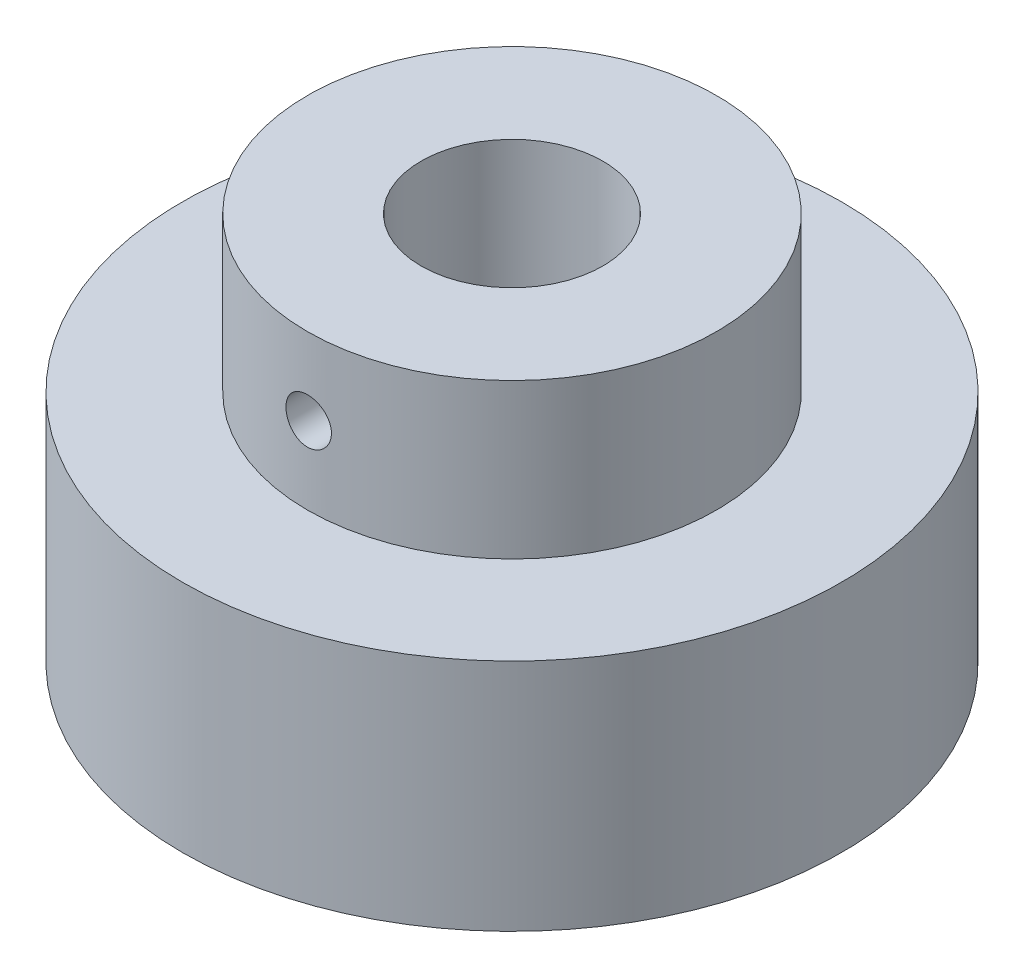
ISO-10303-21;
HEADER;
FILE_DESCRIPTION(('STEP AP214'),'2;1');
FILE_NAME('part.step','',(''),(''),'','','');
FILE_SCHEMA(('AUTOMOTIVE_DESIGN { 1 0 10303 214 1 1 1 1 }'));
ENDSEC;
DATA;
#1=APPLICATION_CONTEXT('core data for automotive mechanical design processes');
#2=APPLICATION_PROTOCOL_DEFINITION('international standard','automotive_design',2000,#1);
#3=PRODUCT_CONTEXT('',#1,'mechanical');
#4=PRODUCT('Part','Part','',(#3));
#5=PRODUCT_RELATED_PRODUCT_CATEGORY('part','',(#4));
#6=PRODUCT_DEFINITION_FORMATION('','',#4);
#7=PRODUCT_DEFINITION_CONTEXT('part definition',#1,'design');
#8=PRODUCT_DEFINITION('design','',#6,#7);
#9=PRODUCT_DEFINITION_SHAPE('','',#8);
#10=(LENGTH_UNIT() NAMED_UNIT(*) SI_UNIT(.MILLI.,.METRE.));
#11=(NAMED_UNIT(*) PLANE_ANGLE_UNIT() SI_UNIT($,.RADIAN.));
#12=(NAMED_UNIT(*) SI_UNIT($,.STERADIAN.) SOLID_ANGLE_UNIT());
#13=UNCERTAINTY_MEASURE_WITH_UNIT(LENGTH_MEASURE(1.E-05),#10,'distance_accuracy_value','');
#14=(GEOMETRIC_REPRESENTATION_CONTEXT(3) GLOBAL_UNCERTAINTY_ASSIGNED_CONTEXT((#13)) GLOBAL_UNIT_ASSIGNED_CONTEXT((#10,
#11,#12)) REPRESENTATION_CONTEXT('',''));
#15=CARTESIAN_POINT('',(0.,0.,0.));
#16=DIRECTION('',(0.,0.,1.));
#17=DIRECTION('',(1.,0.,0.));
#18=AXIS2_PLACEMENT_3D('',#15,#16,#17);
#19=CARTESIAN_POINT('',(0.,10.3,0.));
#20=DIRECTION('',(0.,-1.,0.));
#21=DIRECTION('',(0.,0.,-1.));
#22=AXIS2_PLACEMENT_3D('',#19,#20,#21);
#23=CYLINDRICAL_SURFACE('',#22,4.);
#24=CARTESIAN_POINT('',(0.,17.1,0.));
#25=DIRECTION('',(0.,1.,0.));
#26=DIRECTION('',(0.,0.,1.));
#27=AXIS2_PLACEMENT_3D('',#24,#25,#26);
#28=CIRCLE('',#27,4.);
#29=CARTESIAN_POINT('',(0.,17.1,4.));
#30=VERTEX_POINT('',#29);
#31=EDGE_CURVE('E51',#30,#30,#28,.T.);
#32=ORIENTED_EDGE('',*,*,#31,.T.);
#33=EDGE_LOOP('',(#32));
#34=FACE_BOUND('',#33,.T.);
#35=CARTESIAN_POINT('',(0.,0.,0.));
#36=DIRECTION('',(0.,1.,0.));
#37=DIRECTION('',(0.,0.,1.));
#38=AXIS2_PLACEMENT_3D('',#35,#36,#37);
#39=CIRCLE('',#38,4.);
#40=CARTESIAN_POINT('',(0.,0.,4.));
#41=VERTEX_POINT('',#40);
#42=EDGE_CURVE('E43',#41,#41,#39,.T.);
#43=ORIENTED_EDGE('',*,*,#42,.F.);
#44=EDGE_LOOP('',(#43));
#45=FACE_BOUND('',#44,.T.);
#46=CARTESIAN_POINT('',(-1.,13.7,3.87298334620741));
#47=CARTESIAN_POINT('',(-0.999998431438699,13.7552203003568,3.87298440057185));
#48=CARTESIAN_POINT('',(-0.995410498208069,13.8104579594314,3.87417722499278));
#49=CARTESIAN_POINT('',(-0.977209250194446,13.9193470312326,3.87880744892249));
#50=CARTESIAN_POINT('',(-0.963590682698077,13.97299750178,3.8822461547418));
#51=CARTESIAN_POINT('',(-0.927796479849634,14.0771214152878,3.89095489813012));
#52=CARTESIAN_POINT('',(-0.905631891140943,14.1275988621578,3.8962225706936));
#53=CARTESIAN_POINT('',(-0.853408456505407,14.2241243410125,3.90799276818327));
#54=CARTESIAN_POINT('',(-0.823349275424505,14.2701721848311,3.91449534553241));
#55=CARTESIAN_POINT('',(-0.755483370924517,14.3575446581058,3.92816286540368));
#56=CARTESIAN_POINT('',(-0.717534755081556,14.3987574401403,3.93533839048709));
#57=CARTESIAN_POINT('',(-0.635272825640327,14.4743045577439,3.94945150206622));
#58=CARTESIAN_POINT('',(-0.590958917672138,14.5086382502486,3.95638906626691));
#59=CARTESIAN_POINT('',(-0.496458080431563,14.5699101870526,3.96936166208095));
#60=CARTESIAN_POINT('',(-0.446197830478042,14.5967385552646,3.975382749602));
#61=CARTESIAN_POINT('',(-0.341705273717108,14.6415238576612,3.9857232477043));
#62=CARTESIAN_POINT('',(-0.287473554316776,14.6594821007662,3.99004290933747));
#63=CARTESIAN_POINT('',(-0.177743503501662,14.6856591338314,3.99641903539262));
#64=CARTESIAN_POINT('',(-0.122293087819588,14.6940678577306,3.99851957537723));
#65=CARTESIAN_POINT('',(-0.0107315277051064,14.7015033517102,4.00037437642922));
#66=CARTESIAN_POINT('',(0.0453795178152289,14.7005315088838,4.00012898438682));
#67=CARTESIAN_POINT('',(0.155352247172389,14.6893700598999,3.99735237981413));
#68=CARTESIAN_POINT('',(0.209236215601069,14.6793854699785,3.99487200936349));
#69=CARTESIAN_POINT('',(0.314538247413688,14.6508114919806,3.98796334609942));
#70=CARTESIAN_POINT('',(0.365956179370439,14.632221645849,3.98353494959376));
#71=CARTESIAN_POINT('',(0.465406703501808,14.5867989717252,3.97315003880358));
#72=CARTESIAN_POINT('',(0.513404509766506,14.5598931821353,3.96718007878021));
#73=CARTESIAN_POINT('',(0.60427562234049,14.4986577283535,3.9543596152386));
#74=CARTESIAN_POINT('',(0.647148035085507,14.4643267725758,3.94750895860996));
#75=CARTESIAN_POINT('',(0.727774035084958,14.388116503207,3.93345485507808));
#76=CARTESIAN_POINT('',(0.765357679075201,14.3460580430609,3.92624687810367));
#77=CARTESIAN_POINT('',(0.83297637596302,14.2561600105839,3.91246017406682));
#78=CARTESIAN_POINT('',(0.863011076046017,14.2083201682036,3.90588147642388));
#79=CARTESIAN_POINT('',(0.914788129022599,14.1078839863404,3.89408198732659));
#80=CARTESIAN_POINT('',(0.936489566970492,14.0552657078747,3.88886793490288));
#81=CARTESIAN_POINT('',(0.970685620636341,13.9469658127694,3.88047456055983));
#82=CARTESIAN_POINT('',(0.983182206552911,13.8912848544067,3.87729480324087));
#83=CARTESIAN_POINT('',(0.998331855466072,13.7800161993908,3.87342142415656));
#84=CARTESIAN_POINT('',(1.00123618956785,13.7244648826681,3.87266435637459));
#85=CARTESIAN_POINT('',(0.99780679620622,13.6136712253687,3.87354937392416));
#86=CARTESIAN_POINT('',(0.991473919139521,13.5584288568195,3.87519123840506));
#87=CARTESIAN_POINT('',(0.969970185575065,13.4507542940181,3.88062832781824));
#88=CARTESIAN_POINT('',(0.954945627312699,13.3982909093717,3.8843878809375));
#89=CARTESIAN_POINT('',(0.916647232668249,13.2966274168593,3.89360287308385));
#90=CARTESIAN_POINT('',(0.893372419085018,13.2474276963779,3.89905851299445));
#91=CARTESIAN_POINT('',(0.838708267174623,13.1526234888531,3.91118454837305));
#92=CARTESIAN_POINT('',(0.807168701534252,13.1071084639828,3.91787667442657));
#93=CARTESIAN_POINT('',(0.737060292934455,13.0219246548795,3.93166833228686));
#94=CARTESIAN_POINT('',(0.698490294805439,12.98225683334,3.93876793091388));
#95=CARTESIAN_POINT('',(0.614262720984725,12.9088755829716,3.95278961212643));
#96=CARTESIAN_POINT('',(0.568451952531592,12.8753359749805,3.95970280824734));
#97=CARTESIAN_POINT('',(0.471702682694675,12.8164256532195,3.97238886645494));
#98=CARTESIAN_POINT('',(0.42076444895759,12.7910545133567,3.97816178801584));
#99=CARTESIAN_POINT('',(0.315558201731089,12.7494215861888,3.98788046295326));
#100=CARTESIAN_POINT('',(0.26131738102788,12.7330942862484,3.99183932008964));
#101=CARTESIAN_POINT('',(0.150749760318807,12.7098158661566,3.99754117358315));
#102=CARTESIAN_POINT('',(0.0944233650412426,12.7028629365044,3.99928459757363));
#103=CARTESIAN_POINT('',(-0.0170835264433272,12.6986324104245,4.00034169408811));
#104=CARTESIAN_POINT('',(-0.0722538269660338,12.7010982909046,3.99971978880008));
#105=CARTESIAN_POINT('',(-0.18136749641474,12.7150478272943,3.99625896457423));
#106=CARTESIAN_POINT('',(-0.235310901780887,12.7265312150131,3.99342011157094));
#107=CARTESIAN_POINT('',(-0.340171035644816,12.7580522197709,3.98585432853963));
#108=CARTESIAN_POINT('',(-0.391102494581019,12.7780434533146,3.98113764502668));
#109=CARTESIAN_POINT('',(-0.488917053041468,12.8259705790193,3.97031288913382));
#110=CARTESIAN_POINT('',(-0.53579964126505,12.8539074726696,3.96420464137727));
#111=CARTESIAN_POINT('',(-0.6254019284239,12.9177152339971,3.95107249681342));
#112=CARTESIAN_POINT('',(-0.667994988300587,12.9537601429074,3.94403016945647));
#113=CARTESIAN_POINT('',(-0.746615020271251,13.0324228519738,3.92990649053207));
#114=CARTESIAN_POINT('',(-0.782640325068177,13.0750423160979,3.92282512952424));
#115=CARTESIAN_POINT('',(-0.84776202647924,13.1666014142013,3.90927475860683));
#116=CARTESIAN_POINT('',(-0.876716619446593,13.2156441234125,3.90281963730391));
#117=CARTESIAN_POINT('',(-0.925926896615622,13.3180554899228,3.8914395555011));
#118=CARTESIAN_POINT('',(-0.946188909759557,13.3714209661073,3.88651348244814));
#119=CARTESIAN_POINT('',(-0.974422528565571,13.4705770118263,3.87951908741315));
#120=CARTESIAN_POINT('',(-0.983993170595829,13.5158931643824,3.87708663005761));
#121=CARTESIAN_POINT('',(-0.996782292572819,13.6074688690015,3.87381838580358));
#122=CARTESIAN_POINT('',(-1.00000131437052,13.6537283402506,3.87298246270638));
#123=CARTESIAN_POINT('',(-1.,13.7,3.87298334620741));
#124=B_SPLINE_CURVE_WITH_KNOTS('',3,(#46,#47,#48,#49,#50,#51,#52,#53,#54,#55,#56,#57,#58,#59,
#60,#61,#62,#63,#64,#65,#66,#67,#68,#69,#70,#71,#72,#73,#74,#75,#76,#77,#78,#79,#80,#81,#82,#83,
#84,#85,#86,#87,#88,#89,#90,#91,#92,#93,#94,#95,#96,#97,#98,#99,#100,#101,#102,#103,#104,#105,
#106,#107,#108,#109,#110,#111,#112,#113,#114,#115,#116,#117,#118,#119,#120,#121,#122,#123),
.UNSPECIFIED.,.T.,.F.,(4,2,2,2,2,2,2,2,2,2,2,2,2,2,2,2,2,2,2,2,2,2,2,2,2,2,2,2,2,2,2,2,2,2,2,2,
2,2,4),(0.,0.165490976675229,0.331078296534212,0.496452290829151,0.661833306984659,
0.830495816734649,0.999174085882212,1.17020598555443,1.34121263935112,1.50875500394413,
1.67627259462683,1.84007305071853,2.00388222686189,2.16917149698052,2.3344895418384,
2.50428186625039,2.67408212476195,2.84470572799636,3.01529280048093,3.18137429900961,
3.34744050869795,3.51078961999957,3.67415808564842,3.84073138339938,4.00733207550293,
4.17810132382402,4.34886166284096,4.51836829119047,4.6878421955989,4.85273378447257,
5.01762046947067,5.18161950620159,5.34563922291504,5.51358838629103,5.68158012622478,
5.85270590910146,6.02370688542923,6.16239130867207,6.30106390036083),.UNSPECIFIED.);
#125=CARTESIAN_POINT('',(-1.,13.7,3.87298334620741));
#126=VERTEX_POINT('',#125);
#127=EDGE_CURVE('E56',#126,#126,#124,.T.);
#128=ORIENTED_EDGE('',*,*,#127,.F.);
#129=EDGE_LOOP('',(#128));
#130=FACE_BOUND('',#129,.T.);
#131=ADVANCED_FACE('F32',(#34,#45,#130),#23,.F.);
#132=CARTESIAN_POINT('',(0.,17.1,0.));
#133=DIRECTION('',(0.,-1.,0.));
#134=DIRECTION('',(0.,0.,-1.));
#135=AXIS2_PLACEMENT_3D('',#132,#133,#134);
#136=CYLINDRICAL_SURFACE('',#135,9.);
#137=CARTESIAN_POINT('',(0.,17.1,0.));
#138=DIRECTION('',(0.,1.,0.));
#139=DIRECTION('',(0.,0.,1.));
#140=AXIS2_PLACEMENT_3D('',#137,#138,#139);
#141=CIRCLE('',#140,9.);
#142=CARTESIAN_POINT('',(0.,17.1,9.));
#143=VERTEX_POINT('',#142);
#144=EDGE_CURVE('E47',#143,#143,#141,.T.);
#145=ORIENTED_EDGE('',*,*,#144,.F.);
#146=EDGE_LOOP('',(#145));
#147=FACE_BOUND('',#146,.T.);
#148=CARTESIAN_POINT('',(0.,10.3,0.));
#149=DIRECTION('',(0.,1.,0.));
#150=DIRECTION('',(0.,0.,1.));
#151=AXIS2_PLACEMENT_3D('',#148,#149,#150);
#152=CIRCLE('',#151,9.);
#153=CARTESIAN_POINT('',(0.,10.3,9.));
#154=VERTEX_POINT('',#153);
#155=EDGE_CURVE('E48',#154,#154,#152,.T.);
#156=ORIENTED_EDGE('',*,*,#155,.T.);
#157=EDGE_LOOP('',(#156));
#158=FACE_BOUND('',#157,.T.);
#159=CARTESIAN_POINT('',(-1.,13.7,8.94427190999916));
#160=CARTESIAN_POINT('',(-0.999997592517875,13.7559841134771,8.94427263367565));
#161=CARTESIAN_POINT('',(-0.995282822112476,13.8120043997645,8.94480320415309));
#162=CARTESIAN_POINT('',(-0.976547278566351,13.9224893440569,8.94686765346894));
#163=CARTESIAN_POINT('',(-0.962516471439663,13.9769522586248,8.94840261407588));
#164=CARTESIAN_POINT('',(-0.925564609414937,14.0827066190251,8.95229988148852));
#165=CARTESIAN_POINT('',(-0.902649212715238,14.1340000592984,8.95466166163706));
#166=CARTESIAN_POINT('',(-0.848590069926098,14.2320025156466,8.95994581317675));
#167=CARTESIAN_POINT('',(-0.817447862806944,14.2787123869201,8.96286807969105));
#168=CARTESIAN_POINT('',(-0.747670331059774,14.3664402490907,8.96895851522341));
#169=CARTESIAN_POINT('',(-0.709005756930021,14.4074349131791,8.9721276141911));
#170=CARTESIAN_POINT('',(-0.625343781006238,14.4823675269533,8.97834623227899));
#171=CARTESIAN_POINT('',(-0.580346079268708,14.5163051422211,8.98139574572675));
#172=CARTESIAN_POINT('',(-0.485150487955431,14.5762423713018,8.98704094371252));
#173=CARTESIAN_POINT('',(-0.434939383130973,14.6022211186168,8.98963542778046));
#174=CARTESIAN_POINT('',(-0.330833735758998,14.6453696180994,8.99406807097666));
#175=CARTESIAN_POINT('',(-0.276939302567786,14.6625396316657,8.99590625254782));
#176=CARTESIAN_POINT('',(-0.167234004310948,14.6875142466109,8.99861263899254));
#177=CARTESIAN_POINT('',(-0.111432014779653,14.6953573958942,8.99948483524639));
#178=CARTESIAN_POINT('',(0.000702562392755718,14.7015749986515,9.00017457787683));
#179=CARTESIAN_POINT('',(0.0570351332461721,14.6999497507094,8.99999215751051));
#180=CARTESIAN_POINT('',(0.168369872939786,14.687307817609,8.9985964714074));
#181=CARTESIAN_POINT('',(0.223376813736901,14.6763325853241,8.99738775579826));
#182=CARTESIAN_POINT('',(0.330763137249333,14.6453669007365,8.99408046986786));
#183=CARTESIAN_POINT('',(0.383142479068622,14.6253763081668,8.99198188570148));
#184=CARTESIAN_POINT('',(0.483916439759061,14.5769024843917,8.98712289889434));
#185=CARTESIAN_POINT('',(0.532302245558591,14.5484010788441,8.98436108245632));
#186=CARTESIAN_POINT('',(0.623619484715399,14.4837278846566,8.97848515512571));
#187=CARTESIAN_POINT('',(0.666550720299522,14.4475558180187,8.9753710314668));
#188=CARTESIAN_POINT('',(0.745983267326587,14.3683353584564,8.96911970576883));
#189=CARTESIAN_POINT('',(0.78244859316637,14.325250876728,8.96598246993295));
#190=CARTESIAN_POINT('',(0.847635154523855,14.2335532376573,8.96005521211826));
#191=CARTESIAN_POINT('',(0.87635637402559,14.1849400688812,8.95726519085754));
#192=CARTESIAN_POINT('',(0.92524018552687,14.0835355132651,8.95234814495897));
#193=CARTESIAN_POINT('',(0.945400279904714,14.0307429124402,8.95022131384815));
#194=CARTESIAN_POINT('',(0.976559666068438,13.922492992121,8.94687537727145));
#195=CARTESIAN_POINT('',(0.987559304165002,13.8670357734464,8.94565623749051));
#196=CARTESIAN_POINT('',(1.00003867967784,13.7553475534825,8.94426981735941));
#197=CARTESIAN_POINT('',(1.00156888541938,13.6991222577034,8.94409696084191));
#198=CARTESIAN_POINT('',(0.995198759551076,13.5872160864843,8.94480795192882));
#199=CARTESIAN_POINT('',(0.987298585903105,13.5315352019411,8.94569178183338));
#200=CARTESIAN_POINT('',(0.962334295937793,13.4224472573302,8.94841148256715));
#201=CARTESIAN_POINT('',(0.945294282379423,13.3690346136621,8.95024484892916));
#202=CARTESIAN_POINT('',(0.902558706994954,13.265825314408,8.95465502047818));
#203=CARTESIAN_POINT('',(0.876862902220306,13.2160287603652,8.95723184653215));
#204=CARTESIAN_POINT('',(0.817419705165276,13.1212358534032,8.96285203814234));
#205=CARTESIAN_POINT('',(0.783639014378036,13.076260496531,8.96589731402506));
#206=CARTESIAN_POINT('',(0.709032406964765,12.992600131383,8.97210513969875));
#207=CARTESIAN_POINT('',(0.668206274613176,12.953915315789,8.97526769307832));
#208=CARTESIAN_POINT('',(0.580448104861648,12.8837587573399,8.98137069627024));
#209=CARTESIAN_POINT('',(0.533489583365998,12.8523200383609,8.98431008980798));
#210=CARTESIAN_POINT('',(0.43492957981849,12.7977758715866,8.98962004039814));
#211=CARTESIAN_POINT('',(0.383328174176452,12.7746702866808,8.99199060680962));
#212=CARTESIAN_POINT('',(0.277060132472967,12.7375036355514,8.99589107248185));
#213=CARTESIAN_POINT('',(0.222400415783412,12.7234229839971,8.99742279109672));
#214=CARTESIAN_POINT('',(0.11147460037896,12.7046420592662,8.99948048346296));
#215=CARTESIAN_POINT('',(0.0552085582366676,12.6999414561495,9.00000649258983));
#216=CARTESIAN_POINT('',(-0.0570091672484455,12.7000593318663,8.99999341978676));
#217=CARTESIAN_POINT('',(-0.112960911922298,12.7048266907871,8.99946005766744));
#218=CARTESIAN_POINT('',(-0.223263158463232,12.7236375183905,8.99739948433675));
#219=CARTESIAN_POINT('',(-0.277613659957472,12.737680989233,8.99587227289397));
#220=CARTESIAN_POINT('',(-0.383167538307875,12.7746304220187,8.99199497720236));
#221=CARTESIAN_POINT('',(-0.434371588038439,12.7975344814119,8.98964506961354));
#222=CARTESIAN_POINT('',(-0.532216958324812,12.8515495919828,8.98438359909209));
#223=CARTESIAN_POINT('',(-0.578858271386062,12.8826606566407,8.98147203523692));
#224=CARTESIAN_POINT('',(-0.666515949250372,12.9523974482085,8.97539414841483));
#225=CARTESIAN_POINT('',(-0.707501925820612,12.9910612656985,8.97222658393826));
#226=CARTESIAN_POINT('',(-0.782425417953736,13.0747286645393,8.96600400083303));
#227=CARTESIAN_POINT('',(-0.816361249856336,13.1197337559668,8.96294900923112));
#228=CARTESIAN_POINT('',(-0.876307066925761,13.2149615898369,8.95728742883615));
#229=CARTESIAN_POINT('',(-0.902292320826933,13.2651999743289,8.95468224997417));
#230=CARTESIAN_POINT('',(-0.945422239485254,13.3693257184217,8.9502319056383));
#231=CARTESIAN_POINT('',(-0.962576727612491,13.4232089476347,8.94838589612409));
#232=CARTESIAN_POINT('',(-0.983351215774209,13.5144889374722,8.94612126550641));
#233=CARTESIAN_POINT('',(-0.989585793834226,13.5513051811598,8.94543110871662));
#234=CARTESIAN_POINT('',(-0.997910976611058,13.6254089315347,8.94450619111618));
#235=CARTESIAN_POINT('',(-1.00000160416337,13.6626964356238,8.94427142779607));
#236=CARTESIAN_POINT('',(-1.,13.7,8.94427190999916));
#237=B_SPLINE_CURVE_WITH_KNOTS('',3,(#159,#160,#161,#162,#163,#164,#165,#166,#167,#168,#169,
#170,#171,#172,#173,#174,#175,#176,#177,#178,#179,#180,#181,#182,#183,#184,#185,#186,#187,#188,
#189,#190,#191,#192,#193,#194,#195,#196,#197,#198,#199,#200,#201,#202,#203,#204,#205,#206,#207,
#208,#209,#210,#211,#212,#213,#214,#215,#216,#217,#218,#219,#220,#221,#222,#223,#224,#225,#226,
#227,#228,#229,#230,#231,#232,#233,#234,#235,#236),.UNSPECIFIED.,.T.,.F.,(4,2,2,2,2,2,2,2,2,2,2,
2,2,2,2,2,2,2,2,2,2,2,2,2,2,2,2,2,2,2,2,2,2,2,2,2,2,2,4),(0.,0.167816094312487,
0.335813231467328,0.503703554025015,0.671562491943664,0.840087659677715,1.00862081162627,
1.17759211396053,1.34655840179297,1.51482389806979,1.68308408815944,1.85060216087683,
2.01812284004196,2.18600383962578,2.35389092454426,2.52268489532751,2.69147921519915,
2.8603227453326,3.02915989205335,3.19709642315278,3.36503014130095,3.53252316164429,
3.70002088353095,3.86822070886243,4.03642568524668,4.20538272665269,4.37433698797282,
4.54292334295313,4.71150376785725,4.8791764590021,5.0468491891884,5.21448593656707,
5.38212295929422,5.55062832814459,5.71917389198525,5.88823852910647,6.0571146895969,
6.16893521484786,6.28075512390304),.UNSPECIFIED.);
#238=CARTESIAN_POINT('',(-1.,13.7,8.94427190999916));
#239=VERTEX_POINT('',#238);
#240=EDGE_CURVE('E64',#239,#239,#237,.T.);
#241=ORIENTED_EDGE('',*,*,#240,.T.);
#242=EDGE_LOOP('',(#241));
#243=FACE_BOUND('',#242,.T.);
#244=ADVANCED_FACE('F81',(#147,#158,#243),#136,.T.);
#245=CARTESIAN_POINT('',(0.,10.3,0.));
#246=DIRECTION('',(0.,1.,0.));
#247=DIRECTION('',(0.,0.,1.));
#248=AXIS2_PLACEMENT_3D('',#245,#246,#247);
#249=PLANE('',#248);
#250=CARTESIAN_POINT('',(0.,10.3,0.));
#251=DIRECTION('',(0.,1.,0.));
#252=DIRECTION('',(0.,0.,1.));
#253=AXIS2_PLACEMENT_3D('',#250,#251,#252);
#254=CIRCLE('',#253,14.5);
#255=CARTESIAN_POINT('',(0.,10.3,-14.5));
#256=VERTEX_POINT('',#255);
#257=EDGE_CURVE('E10',#256,#256,#254,.T.);
#258=ORIENTED_EDGE('',*,*,#257,.T.);
#259=EDGE_LOOP('',(#258));
#260=FACE_BOUND('',#259,.T.);
#261=ORIENTED_EDGE('',*,*,#155,.F.);
#262=EDGE_LOOP('',(#261));
#263=FACE_BOUND('',#262,.T.);
#264=ADVANCED_FACE('F84',(#260,#263),#249,.T.);
#265=CARTESIAN_POINT('',(0.,0.,0.));
#266=DIRECTION('',(0.,1.,0.));
#267=DIRECTION('',(0.,0.,1.));
#268=AXIS2_PLACEMENT_3D('',#265,#266,#267);
#269=PLANE('',#268);
#270=CARTESIAN_POINT('',(0.,0.,0.));
#271=DIRECTION('',(0.,1.,0.));
#272=DIRECTION('',(0.,0.,1.));
#273=AXIS2_PLACEMENT_3D('',#270,#271,#272);
#274=CIRCLE('',#273,14.5);
#275=CARTESIAN_POINT('',(0.,0.,-14.5));
#276=VERTEX_POINT('',#275);
#277=EDGE_CURVE('E36',#276,#276,#274,.T.);
#278=ORIENTED_EDGE('',*,*,#277,.F.);
#279=EDGE_LOOP('',(#278));
#280=FACE_BOUND('',#279,.T.);
#281=ORIENTED_EDGE('',*,*,#42,.T.);
#282=EDGE_LOOP('',(#281));
#283=FACE_BOUND('',#282,.T.);
#284=ADVANCED_FACE('F90',(#280,#283),#269,.F.);
#285=CARTESIAN_POINT('',(0.,10.3,0.));
#286=DIRECTION('',(0.,-1.,0.));
#287=DIRECTION('',(0.,0.,-1.));
#288=AXIS2_PLACEMENT_3D('',#285,#286,#287);
#289=CYLINDRICAL_SURFACE('',#288,14.5);
#290=CARTESIAN_POINT('',(0.,10.3,-14.5));
#291=CARTESIAN_POINT('',(0.,10.1927083333333,-14.5));
#292=CARTESIAN_POINT('',(0.,10.0854166666667,-14.5));
#293=CARTESIAN_POINT('',(0.,9.87083333333333,-14.5));
#294=CARTESIAN_POINT('',(0.,9.76354166666667,-14.5));
#295=CARTESIAN_POINT('',(0.,9.54895833333333,-14.5));
#296=CARTESIAN_POINT('',(0.,9.44166666666667,-14.5));
#297=CARTESIAN_POINT('',(0.,9.22708333333333,-14.5));
#298=CARTESIAN_POINT('',(0.,9.11979166666667,-14.5));
#299=CARTESIAN_POINT('',(0.,8.90520833333333,-14.5));
#300=CARTESIAN_POINT('',(0.,8.79791666666667,-14.5));
#301=CARTESIAN_POINT('',(0.,8.58333333333333,-14.5));
#302=CARTESIAN_POINT('',(0.,8.47604166666667,-14.5));
#303=CARTESIAN_POINT('',(0.,8.26145833333333,-14.5));
#304=CARTESIAN_POINT('',(0.,8.15416666666667,-14.5));
#305=CARTESIAN_POINT('',(0.,7.93958333333333,-14.5));
#306=CARTESIAN_POINT('',(0.,7.83229166666667,-14.5));
#307=CARTESIAN_POINT('',(0.,7.61770833333333,-14.5));
#308=CARTESIAN_POINT('',(0.,7.51041666666667,-14.5));
#309=CARTESIAN_POINT('',(0.,7.29583333333333,-14.5));
#310=CARTESIAN_POINT('',(0.,7.18854166666666,-14.5));
#311=CARTESIAN_POINT('',(0.,6.97395833333333,-14.5));
#312=CARTESIAN_POINT('',(0.,6.86666666666667,-14.5));
#313=CARTESIAN_POINT('',(0.,6.65208333333333,-14.5));
#314=CARTESIAN_POINT('',(0.,6.54479166666667,-14.5));
#315=CARTESIAN_POINT('',(0.,6.33020833333333,-14.5));
#316=CARTESIAN_POINT('',(0.,6.22291666666667,-14.5));
#317=CARTESIAN_POINT('',(0.,6.00833333333333,-14.5));
#318=CARTESIAN_POINT('',(0.,5.90104166666667,-14.5));
#319=CARTESIAN_POINT('',(0.,5.68645833333333,-14.5));
#320=CARTESIAN_POINT('',(0.,5.57916666666667,-14.5));
#321=CARTESIAN_POINT('',(0.,5.36458333333333,-14.5));
#322=CARTESIAN_POINT('',(0.,5.25729166666667,-14.5));
#323=CARTESIAN_POINT('',(0.,5.04270833333333,-14.5));
#324=CARTESIAN_POINT('',(0.,4.93541666666667,-14.5));
#325=CARTESIAN_POINT('',(0.,4.72083333333333,-14.5));
#326=CARTESIAN_POINT('',(0.,4.61354166666666,-14.5));
#327=CARTESIAN_POINT('',(0.,4.39895833333333,-14.5));
#328=CARTESIAN_POINT('',(0.,4.29166666666667,-14.5));
#329=CARTESIAN_POINT('',(0.,4.07708333333333,-14.5));
#330=CARTESIAN_POINT('',(0.,3.96979166666666,-14.5));
#331=CARTESIAN_POINT('',(0.,3.75520833333333,-14.5));
#332=CARTESIAN_POINT('',(0.,3.64791666666666,-14.5));
#333=CARTESIAN_POINT('',(0.,3.43333333333333,-14.5));
#334=CARTESIAN_POINT('',(0.,3.32604166666666,-14.5));
#335=CARTESIAN_POINT('',(0.,3.11145833333333,-14.5));
#336=CARTESIAN_POINT('',(0.,3.00416666666666,-14.5));
#337=CARTESIAN_POINT('',(0.,2.78958333333333,-14.5));
#338=CARTESIAN_POINT('',(0.,2.68229166666666,-14.5));
#339=CARTESIAN_POINT('',(0.,2.46770833333333,-14.5));
#340=CARTESIAN_POINT('',(0.,2.36041666666667,-14.5));
#341=CARTESIAN_POINT('',(0.,2.14583333333333,-14.5));
#342=CARTESIAN_POINT('',(0.,2.03854166666667,-14.5));
#343=CARTESIAN_POINT('',(0.,1.82395833333333,-14.5));
#344=CARTESIAN_POINT('',(0.,1.71666666666667,-14.5));
#345=CARTESIAN_POINT('',(0.,1.50208333333333,-14.5));
#346=CARTESIAN_POINT('',(0.,1.39479166666667,-14.5));
#347=CARTESIAN_POINT('',(0.,1.18020833333333,-14.5));
#348=CARTESIAN_POINT('',(0.,1.07291666666667,-14.5));
#349=CARTESIAN_POINT('',(0.,0.858333333333333,-14.5));
#350=CARTESIAN_POINT('',(0.,0.751041666666665,-14.5));
#351=CARTESIAN_POINT('',(0.,0.536458333333331,-14.5));
#352=CARTESIAN_POINT('',(0.,0.429166666666664,-14.5));
#353=CARTESIAN_POINT('',(0.,0.214583333333331,-14.5));
#354=CARTESIAN_POINT('',(0.,0.107291666666665,-14.5));
#355=CARTESIAN_POINT('',(0.,0.,-14.5));
#356=B_SPLINE_CURVE_WITH_KNOTS('',3,(#290,#291,#292,#293,#294,#295,#296,#297,#298,#299,#300,
#301,#302,#303,#304,#305,#306,#307,#308,#309,#310,#311,#312,#313,#314,#315,#316,#317,#318,#319,
#320,#321,#322,#323,#324,#325,#326,#327,#328,#329,#330,#331,#332,#333,#334,#335,#336,#337,#338,
#339,#340,#341,#342,#343,#344,#345,#346,#347,#348,#349,#350,#351,#352,#353,#354,#355),
.UNSPECIFIED.,.F.,.F.,(4,2,2,2,2,2,2,2,2,2,2,2,2,2,2,2,2,2,2,2,2,2,2,2,2,2,2,2,2,2,2,2,4),(0.,
0.321875000000001,0.64375,0.965625000000001,1.2875,1.609375,1.93125,2.253125,2.575,2.896875,
3.21875,3.540625,3.8625,4.184375,4.50625,4.828125,5.15,5.471875,5.79375,6.115625,6.4375,
6.759375,7.08125,7.403125,7.725,8.046875,8.36875,8.690625,9.0125,9.334375,9.65625,9.978125,
10.3),.UNSPECIFIED.);
#357=EDGE_CURVE('BSEAM34',#256,#276,#356,.T.);
#358=ORIENTED_EDGE('',*,*,#257,.F.);
#359=ORIENTED_EDGE('',*,*,#277,.T.);
#360=ORIENTED_EDGE('',*,*,#357,.T.);
#361=ORIENTED_EDGE('',*,*,#357,.F.);
#362=EDGE_LOOP('',(#358,#360,#359,#361));
#363=FACE_BOUND('',#362,.T.);
#364=ADVANCED_FACE('F34',(#363),#289,.T.);
#365=CARTESIAN_POINT('',(0.,17.1,0.));
#366=DIRECTION('',(0.,1.,0.));
#367=DIRECTION('',(0.,0.,1.));
#368=AXIS2_PLACEMENT_3D('',#365,#366,#367);
#369=PLANE('',#368);
#370=ORIENTED_EDGE('',*,*,#144,.T.);
#371=EDGE_LOOP('',(#370));
#372=FACE_BOUND('',#371,.T.);
#373=ORIENTED_EDGE('',*,*,#31,.F.);
#374=EDGE_LOOP('',(#373));
#375=FACE_BOUND('',#374,.T.);
#376=ADVANCED_FACE('F75',(#372,#375),#369,.T.);
#377=CARTESIAN_POINT('',(0.,13.7,14.501));
#378=DIRECTION('',(0.,0.,-1.));
#379=DIRECTION('',(-1.,0.,0.));
#380=AXIS2_PLACEMENT_3D('',#377,#378,#379);
#381=CYLINDRICAL_SURFACE('',#380,1.);
#382=ORIENTED_EDGE('',*,*,#127,.T.);
#383=EDGE_LOOP('',(#382));
#384=FACE_BOUND('',#383,.T.);
#385=ORIENTED_EDGE('',*,*,#240,.F.);
#386=EDGE_LOOP('',(#385));
#387=FACE_BOUND('',#386,.T.);
#388=ADVANCED_FACE('F69',(#384,#387),#381,.F.);
#389=CLOSED_SHELL('',(#131,#244,#264,#284,#364,#376,#388));
#390=MANIFOLD_SOLID_BREP('B2',#389);
#391=ADVANCED_BREP_SHAPE_REPRESENTATION('',(#18,#390),#14);
#392=SHAPE_DEFINITION_REPRESENTATION(#9,#391);
ENDSEC;
END-ISO-10303-21;
